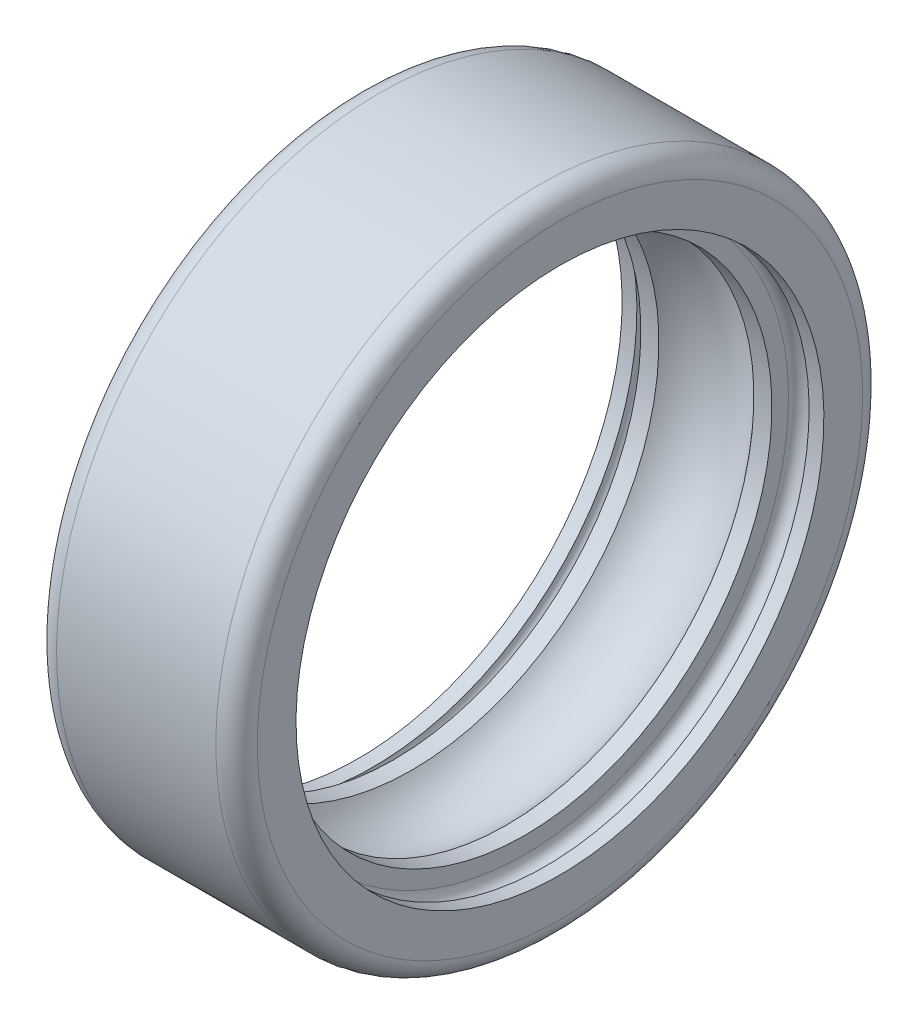
ISO-10303-21;
HEADER;
FILE_DESCRIPTION(('STEP AP214'),'2;1');
FILE_NAME('part.step','',(''),(''),'','','');
FILE_SCHEMA(('AUTOMOTIVE_DESIGN { 1 0 10303 214 1 1 1 1 }'));
ENDSEC;
DATA;
#1=APPLICATION_CONTEXT('core data for automotive mechanical design processes');
#2=APPLICATION_PROTOCOL_DEFINITION('international standard','automotive_design',2000,#1);
#3=PRODUCT_CONTEXT('',#1,'mechanical');
#4=PRODUCT('Part','Part','',(#3));
#5=PRODUCT_RELATED_PRODUCT_CATEGORY('part','',(#4));
#6=PRODUCT_DEFINITION_FORMATION('','',#4);
#7=PRODUCT_DEFINITION_CONTEXT('part definition',#1,'design');
#8=PRODUCT_DEFINITION('design','',#6,#7);
#9=PRODUCT_DEFINITION_SHAPE('','',#8);
#10=(LENGTH_UNIT() NAMED_UNIT(*) SI_UNIT(.MILLI.,.METRE.));
#11=(NAMED_UNIT(*) PLANE_ANGLE_UNIT() SI_UNIT($,.RADIAN.));
#12=(NAMED_UNIT(*) SI_UNIT($,.STERADIAN.) SOLID_ANGLE_UNIT());
#13=UNCERTAINTY_MEASURE_WITH_UNIT(LENGTH_MEASURE(1.E-05),#10,'distance_accuracy_value','');
#14=(GEOMETRIC_REPRESENTATION_CONTEXT(3) GLOBAL_UNCERTAINTY_ASSIGNED_CONTEXT((#13)) GLOBAL_UNIT_ASSIGNED_CONTEXT((#10,
#11,#12)) REPRESENTATION_CONTEXT('',''));
#15=CARTESIAN_POINT('',(0.,0.,0.));
#16=DIRECTION('',(0.,0.,1.));
#17=DIRECTION('',(1.,0.,0.));
#18=AXIS2_PLACEMENT_3D('',#15,#16,#17);
#19=CARTESIAN_POINT('',(-1.96724551980823,0.000700500354214024,0.));
#20=DIRECTION('',(-0.999999919699005,-0.000400751771926105,0.));
#21=DIRECTION('',(0.000400751771926105,-0.999999919699005,0.));
#22=AXIS2_PLACEMENT_3D('',#19,#20,#21);
#23=CONICAL_SURFACE('',#22,8.00078937773568,0.000400751782652794);
#24=CARTESIAN_POINT('',(1.97753265640106,0.00228137732513132,0.));
#25=DIRECTION('',(0.999999919699005,0.000400751771926105,0.));
#26=DIRECTION('',(-0.000400751771926105,0.999999919699005,0.));
#27=AXIS2_PLACEMENT_3D('',#24,#25,#26);
#28=CIRCLE('',#27,7.99920850063782);
#29=CARTESIAN_POINT('',(1.97432695942043,8.00148923561855,0.));
#30=VERTEX_POINT('',#29);
#31=EDGE_CURVE('E95',#30,#30,#28,.T.);
#32=ORIENTED_EDGE('',*,*,#31,.F.);
#33=EDGE_LOOP('',(#32));
#34=FACE_BOUND('',#33,.T.);
#35=CARTESIAN_POINT('',(-1.96724551980823,0.000700500354214024,0.));
#36=DIRECTION('',(0.999999919699005,0.000400751771926105,0.));
#37=DIRECTION('',(-0.000400751771926105,0.999999919699005,0.));
#38=AXIS2_PLACEMENT_3D('',#35,#36,#37);
#39=CIRCLE('',#38,8.00078937773568);
#40=CARTESIAN_POINT('',(-1.97045185032817,8.00148923561855,0.));
#41=VERTEX_POINT('',#40);
#42=EDGE_CURVE('E99',#41,#41,#39,.T.);
#43=ORIENTED_EDGE('',*,*,#42,.T.);
#44=EDGE_LOOP('',(#43));
#45=FACE_BOUND('',#44,.T.);
#46=ADVANCED_FACE('F39',(#34,#45),#23,.T.);
#47=CARTESIAN_POINT('',(2.00300683102444,0.0022915861465694,0.));
#48=DIRECTION('',(0.999999919699005,0.000400751771926105,0.));
#49=DIRECTION('',(-0.000400751771926105,0.999999919699005,0.));
#50=AXIS2_PLACEMENT_3D('',#47,#48,#49);
#51=TOROIDAL_SURFACE('',#50,7.49985450110418,0.500003350515984);
#52=CARTESIAN_POINT('',(2.50300464001636,0.00249196117057277,0.));
#53=DIRECTION('',(0.999999919699005,0.000400751771926105,0.));
#54=DIRECTION('',(-0.000400751771926105,0.999999919699005,0.));
#55=AXIS2_PLACEMENT_3D('',#52,#53,#54);
#56=CIRCLE('',#55,7.49750899895515);
#57=CARTESIAN_POINT('',(2.5,7.50000035806829,0.));
#58=VERTEX_POINT('',#57);
#59=EDGE_CURVE('E91',#58,#58,#56,.T.);
#60=ORIENTED_EDGE('',*,*,#59,.F.);
#61=EDGE_LOOP('',(#60));
#62=FACE_BOUND('',#61,.T.);
#63=ORIENTED_EDGE('',*,*,#31,.T.);
#64=EDGE_LOOP('',(#63));
#65=FACE_BOUND('',#64,.T.);
#66=ADVANCED_FACE('F107',(#62,#65),#51,.T.);
#67=CARTESIAN_POINT('',(-1.99699590845822,0.000688577832289386,0.));
#68=DIRECTION('',(0.999999919699005,0.000400751771926105,0.));
#69=DIRECTION('',(-0.000400751771926105,0.999999919699005,0.));
#70=AXIS2_PLACEMENT_3D('',#67,#68,#69);
#71=TOROIDAL_SURFACE('',#70,7.50167189180653,0.500003350515985);
#72=ORIENTED_EDGE('',*,*,#42,.F.);
#73=EDGE_LOOP('',(#72));
#74=FACE_BOUND('',#73,.T.);
#75=CARTESIAN_POINT('',(-2.49699455697372,0.000488202471846074,0.));
#76=DIRECTION('',(0.999999919699005,0.000400751771926105,0.));
#77=DIRECTION('',(-0.000400751771926105,0.999999919699005,0.));
#78=AXIS2_PLACEMENT_3D('',#75,#76,#77);
#79=CIRCLE('',#78,7.49951275781478);
#80=CARTESIAN_POINT('',(-2.5,7.50000035806829,0.));
#81=VERTEX_POINT('',#80);
#82=EDGE_CURVE('E10',#81,#81,#79,.T.);
#83=ORIENTED_EDGE('',*,*,#82,.T.);
#84=EDGE_LOOP('',(#83));
#85=FACE_BOUND('',#84,.T.);
#86=ADVANCED_FACE('F41',(#74,#85),#71,.T.);
#87=CARTESIAN_POINT('',(2.50262022847898,0.00249180711695565,0.));
#88=DIRECTION('',(0.999999919699005,0.000400751771926105,0.));
#89=DIRECTION('',(-0.000400751771926105,0.999999919699005,0.));
#90=AXIS2_PLACEMENT_3D('',#87,#88,#89);
#91=CONICAL_SURFACE('',#90,6.53828295353222,1.57039557501224);
#92=ORIENTED_EDGE('',*,*,#59,.T.);
#93=EDGE_LOOP('',(#92));
#94=FACE_BOUND('',#93,.T.);
#95=CARTESIAN_POINT('',(2.50262022847898,0.00249180711695565,0.));
#96=DIRECTION('',(0.999999919699005,0.000400751771926105,0.));
#97=DIRECTION('',(-0.000400751771926105,0.999999919699005,0.));
#98=AXIS2_PLACEMENT_3D('',#95,#96,#97);
#99=CIRCLE('',#98,6.53828295353222);
#100=CARTESIAN_POINT('',(2.5,6.54077423561855,0.));
#101=VERTEX_POINT('',#100);
#102=EDGE_CURVE('E87',#101,#101,#99,.T.);
#103=ORIENTED_EDGE('',*,*,#102,.F.);
#104=EDGE_LOOP('',(#103));
#105=FACE_BOUND('',#104,.T.);
#106=ADVANCED_FACE('F106',(#94,#105),#91,.F.);
#107=CARTESIAN_POINT('',(2.50262022847898,0.00249180711695565,0.));
#108=DIRECTION('',(-0.999999919699005,-0.000400751771926105,0.));
#109=DIRECTION('',(0.000400751771926105,-0.999999919699005,0.));
#110=AXIS2_PLACEMENT_3D('',#107,#108,#109);
#111=CONICAL_SURFACE('',#110,6.53828295353222,0.000400751782654719);
#112=CARTESIAN_POINT('',(2.13603771460233,0.00234489851316554,0.));
#113=DIRECTION('',(0.999999919699005,0.000400751771926105,0.));
#114=DIRECTION('',(-0.000400751771926105,0.999999919699005,0.));
#115=AXIS2_PLACEMENT_3D('',#112,#113,#114);
#116=CIRCLE('',#115,6.53842986214781);
#117=CARTESIAN_POINT('',(2.13341742724946,6.54077423561855,0.));
#118=VERTEX_POINT('',#117);
#119=EDGE_CURVE('E83',#118,#118,#116,.T.);
#120=ORIENTED_EDGE('',*,*,#119,.F.);
#121=EDGE_LOOP('',(#120));
#122=FACE_BOUND('',#121,.T.);
#123=ORIENTED_EDGE('',*,*,#102,.T.);
#124=EDGE_LOOP('',(#123));
#125=FACE_BOUND('',#124,.T.);
#126=ADVANCED_FACE('F112',(#122,#125),#111,.F.);
#127=CARTESIAN_POINT('',(1.88111320861438,0.00224273705747968,0.));
#128=DIRECTION('',(0.999999919699005,0.000400751771926105,0.));
#129=DIRECTION('',(-0.000400751771926105,0.999999919699005,0.));
#130=AXIS2_PLACEMENT_3D('',#127,#128,#129);
#131=TOROIDAL_SURFACE('',#130,6.5385320236117,0.254924546929337);
#132=CARTESIAN_POINT('',(1.62618870262643,0.00214057560179409,0.));
#133=DIRECTION('',(0.999999919699005,0.000400751771926105,0.));
#134=DIRECTION('',(-0.000400751771926105,0.999999919699005,0.));
#135=AXIS2_PLACEMENT_3D('',#132,#133,#134);
#136=CIRCLE('',#135,6.53863418507559);
#137=CARTESIAN_POINT('',(1.62356833339078,6.54077423561855,0.));
#138=VERTEX_POINT('',#137);
#139=EDGE_CURVE('E79',#138,#138,#136,.T.);
#140=ORIENTED_EDGE('',*,*,#139,.F.);
#141=EDGE_LOOP('',(#140));
#142=FACE_BOUND('',#141,.T.);
#143=ORIENTED_EDGE('',*,*,#119,.T.);
#144=EDGE_LOOP('',(#143));
#145=FACE_BOUND('',#144,.T.);
#146=ADVANCED_FACE('F126',(#142,#145),#131,.F.);
#147=CARTESIAN_POINT('',(1.62618870262643,0.00214057560179409,0.));
#148=DIRECTION('',(0.999999919699005,0.000400751771926105,0.));
#149=DIRECTION('',(-0.000400751771926105,0.999999919699005,0.));
#150=AXIS2_PLACEMENT_3D('',#147,#148,#149);
#151=CONICAL_SURFACE('',#150,6.53863418507559,1.57039557501224);
#152=CARTESIAN_POINT('',(1.62602401370737,0.00214050960241267,0.));
#153=DIRECTION('',(0.999999919699005,0.000400751771926105,0.));
#154=DIRECTION('',(-0.000400751771926105,0.999999919699005,0.));
#155=AXIS2_PLACEMENT_3D('',#152,#153,#154);
#156=CIRCLE('',#155,6.12768423901864);
#157=CARTESIAN_POINT('',(1.62356833339078,6.12982425656191,0.));
#158=VERTEX_POINT('',#157);
#159=EDGE_CURVE('E75',#158,#158,#156,.T.);
#160=ORIENTED_EDGE('',*,*,#159,.F.);
#161=EDGE_LOOP('',(#160));
#162=FACE_BOUND('',#161,.T.);
#163=ORIENTED_EDGE('',*,*,#139,.T.);
#164=EDGE_LOOP('',(#163));
#165=FACE_BOUND('',#164,.T.);
#166=ADVANCED_FACE('F130',(#162,#165),#151,.F.);
#167=CARTESIAN_POINT('',(1.62602401370737,0.00214050960241267,0.));
#168=DIRECTION('',(-0.999999919699005,-0.000400751771926105,0.));
#169=DIRECTION('',(0.000400751771926105,-0.999999919699005,0.));
#170=AXIS2_PLACEMENT_3D('',#167,#168,#169);
#171=CONICAL_SURFACE('',#170,6.12768423901864,0.000400751782678179);
#172=CARTESIAN_POINT('',(1.17940347315561,0.00196152561503536,0.));
#173=DIRECTION('',(0.999999919699005,0.000400751771926105,0.));
#174=DIRECTION('',(-0.000400751771926105,0.999999919699005,0.));
#175=AXIS2_PLACEMENT_3D('',#172,#173,#174);
#176=CIRCLE('',#175,6.1278632230204);
#177=CARTESIAN_POINT('',(1.17694772111086,6.12982425656192,0.));
#178=VERTEX_POINT('',#177);
#179=EDGE_CURVE('E71',#178,#178,#176,.T.);
#180=ORIENTED_EDGE('',*,*,#179,.F.);
#181=EDGE_LOOP('',(#180));
#182=FACE_BOUND('',#181,.T.);
#183=ORIENTED_EDGE('',*,*,#159,.T.);
#184=EDGE_LOOP('',(#183));
#185=FACE_BOUND('',#184,.T.);
#186=ADVANCED_FACE('F134',(#182,#185),#171,.F.);
#187=CARTESIAN_POINT('',(0.00208326477285036,0.00148971241751422,0.));
#188=DIRECTION('',(0.999999919699005,0.000400751771926105,0.));
#189=DIRECTION('',(-0.000400751771926105,0.999999919699005,0.));
#190=AXIS2_PLACEMENT_3D('',#187,#188,#189);
#191=TOROIDAL_SURFACE('',#190,5.19839191936122,1.5);
#192=CARTESIAN_POINT('',(-1.17449159102584,0.00101819792138638,0.));
#193=DIRECTION('',(0.999999919699005,0.000400751771926105,0.));
#194=DIRECTION('',(-0.000400751771926105,0.999999919699005,0.));
#195=AXIS2_PLACEMENT_3D('',#192,#193,#194);
#196=CIRCLE('',#195,6.1288065507898);
#197=CARTESIAN_POINT('',(-1.17694772111086,6.12982425656192,0.));
#198=VERTEX_POINT('',#197);
#199=EDGE_CURVE('E67',#198,#198,#196,.T.);
#200=ORIENTED_EDGE('',*,*,#199,.F.);
#201=EDGE_LOOP('',(#200));
#202=FACE_BOUND('',#201,.T.);
#203=ORIENTED_EDGE('',*,*,#179,.T.);
#204=EDGE_LOOP('',(#203));
#205=FACE_BOUND('',#204,.T.);
#206=ADVANCED_FACE('F138',(#202,#205),#191,.F.);
#207=CARTESIAN_POINT('',(-1.62111213157761,0.00083921393400907,0.));
#208=DIRECTION('',(-0.999999919699005,-0.000400751771926105,0.));
#209=DIRECTION('',(0.000400751771926105,-0.999999919699005,0.));
#210=AXIS2_PLACEMENT_3D('',#207,#208,#209);
#211=CONICAL_SURFACE('',#210,6.12898553479155,0.000400751782652925);
#212=ORIENTED_EDGE('',*,*,#199,.T.);
#213=EDGE_LOOP('',(#212));
#214=FACE_BOUND('',#213,.T.);
#215=CARTESIAN_POINT('',(-1.62111213157761,0.00083921393400907,0.));
#216=DIRECTION('',(0.999999919699005,0.000400751771926105,0.));
#217=DIRECTION('',(-0.000400751771926105,0.999999919699005,0.));
#218=AXIS2_PLACEMENT_3D('',#215,#216,#217);
#219=CIRCLE('',#218,6.12898553479155);
#220=CARTESIAN_POINT('',(-1.62356833339079,6.12982425656192,0.));
#221=VERTEX_POINT('',#220);
#222=EDGE_CURVE('E63',#221,#221,#219,.T.);
#223=ORIENTED_EDGE('',*,*,#222,.F.);
#224=EDGE_LOOP('',(#223));
#225=FACE_BOUND('',#224,.T.);
#226=ADVANCED_FACE('F142',(#214,#225),#211,.F.);
#227=CARTESIAN_POINT('',(-1.62094744265856,0.000839279933390498,0.));
#228=DIRECTION('',(0.999999919699005,0.000400751771926105,0.));
#229=DIRECTION('',(-0.000400751771926105,0.999999919699005,0.));
#230=AXIS2_PLACEMENT_3D('',#227,#228,#229);
#231=CONICAL_SURFACE('',#230,6.53993548084849,1.57039557501224);
#232=ORIENTED_EDGE('',*,*,#222,.T.);
#233=EDGE_LOOP('',(#232));
#234=FACE_BOUND('',#233,.T.);
#235=CARTESIAN_POINT('',(-1.62094744265856,0.000839279933390498,0.));
#236=DIRECTION('',(0.999999919699005,0.000400751771926105,0.));
#237=DIRECTION('',(-0.000400751771926105,0.999999919699005,0.));
#238=AXIS2_PLACEMENT_3D('',#235,#236,#237);
#239=CIRCLE('',#238,6.53993548084849);
#240=CARTESIAN_POINT('',(-1.62356833339079,6.54077423561855,0.));
#241=VERTEX_POINT('',#240);
#242=EDGE_CURVE('E57',#241,#241,#239,.T.);
#243=ORIENTED_EDGE('',*,*,#242,.F.);
#244=EDGE_LOOP('',(#243));
#245=FACE_BOUND('',#244,.T.);
#246=ADVANCED_FACE('F146',(#234,#245),#231,.T.);
#247=CARTESIAN_POINT('',(-1.8758719486465,0.000737118477704864,0.));
#248=DIRECTION('',(0.999999919699005,0.000400751771926105,0.));
#249=DIRECTION('',(-0.000400751771926105,0.999999919699005,0.));
#250=AXIS2_PLACEMENT_3D('',#247,#248,#249);
#251=TOROIDAL_SURFACE('',#250,6.54003764231238,0.254924546929334);
#252=ORIENTED_EDGE('',*,*,#242,.T.);
#253=EDGE_LOOP('',(#252));
#254=FACE_BOUND('',#253,.T.);
#255=CARTESIAN_POINT('',(-2.13079645463445,0.000634957022019052,0.));
#256=DIRECTION('',(0.999999919699005,0.000400751771926105,0.));
#257=DIRECTION('',(-0.000400751771926105,0.999999919699005,0.));
#258=AXIS2_PLACEMENT_3D('',#255,#256,#257);
#259=CIRCLE('',#258,6.54013980377627);
#260=CARTESIAN_POINT('',(-2.13341742724946,6.54077423561855,0.));
#261=VERTEX_POINT('',#260);
#262=EDGE_CURVE('E52',#261,#261,#259,.T.);
#263=ORIENTED_EDGE('',*,*,#262,.F.);
#264=EDGE_LOOP('',(#263));
#265=FACE_BOUND('',#264,.T.);
#266=ADVANCED_FACE('F150',(#254,#265),#251,.F.);
#267=CARTESIAN_POINT('',(-2.49737896851111,0.000488048418228949,0.));
#268=DIRECTION('',(-0.999999919699005,-0.000400751771926105,0.));
#269=DIRECTION('',(0.000400751771926105,-0.999999919699005,0.));
#270=AXIS2_PLACEMENT_3D('',#267,#268,#269);
#271=CONICAL_SURFACE('',#270,6.54028671239185,0.000400751782652353);
#272=ORIENTED_EDGE('',*,*,#262,.T.);
#273=EDGE_LOOP('',(#272));
#274=FACE_BOUND('',#273,.T.);
#275=CARTESIAN_POINT('',(-2.49737896851111,0.000488048418228949,0.));
#276=DIRECTION('',(0.999999919699005,0.000400751771926105,0.));
#277=DIRECTION('',(-0.000400751771926105,0.999999919699005,0.));
#278=AXIS2_PLACEMENT_3D('',#275,#276,#277);
#279=CIRCLE('',#278,6.54028671239185);
#280=CARTESIAN_POINT('',(-2.5,6.54077423561855,0.));
#281=VERTEX_POINT('',#280);
#282=EDGE_CURVE('E47',#281,#281,#279,.T.);
#283=ORIENTED_EDGE('',*,*,#282,.F.);
#284=EDGE_LOOP('',(#283));
#285=FACE_BOUND('',#284,.T.);
#286=ADVANCED_FACE('F154',(#274,#285),#271,.F.);
#287=CARTESIAN_POINT('',(-2.49737896851111,0.000488048418228949,0.));
#288=DIRECTION('',(0.999999919699005,0.000400751771926105,0.));
#289=DIRECTION('',(-0.000400751771926105,0.999999919699005,0.));
#290=AXIS2_PLACEMENT_3D('',#287,#288,#289);
#291=CONICAL_SURFACE('',#290,6.54028671239185,1.57039557501224);
#292=ORIENTED_EDGE('',*,*,#82,.F.);
#293=EDGE_LOOP('',(#292));
#294=FACE_BOUND('',#293,.T.);
#295=ORIENTED_EDGE('',*,*,#282,.T.);
#296=EDGE_LOOP('',(#295));
#297=FACE_BOUND('',#296,.T.);
#298=ADVANCED_FACE('F157',(#294,#297),#291,.T.);
#299=CLOSED_SHELL('',(#46,#66,#86,#106,#126,#146,#166,#186,#206,#226,#246,#266,#286,#298));
#300=MANIFOLD_SOLID_BREP('B2',#299);
#301=ADVANCED_BREP_SHAPE_REPRESENTATION('',(#18,#300),#14);
#302=SHAPE_DEFINITION_REPRESENTATION(#9,#301);
ENDSEC;
END-ISO-10303-21;
